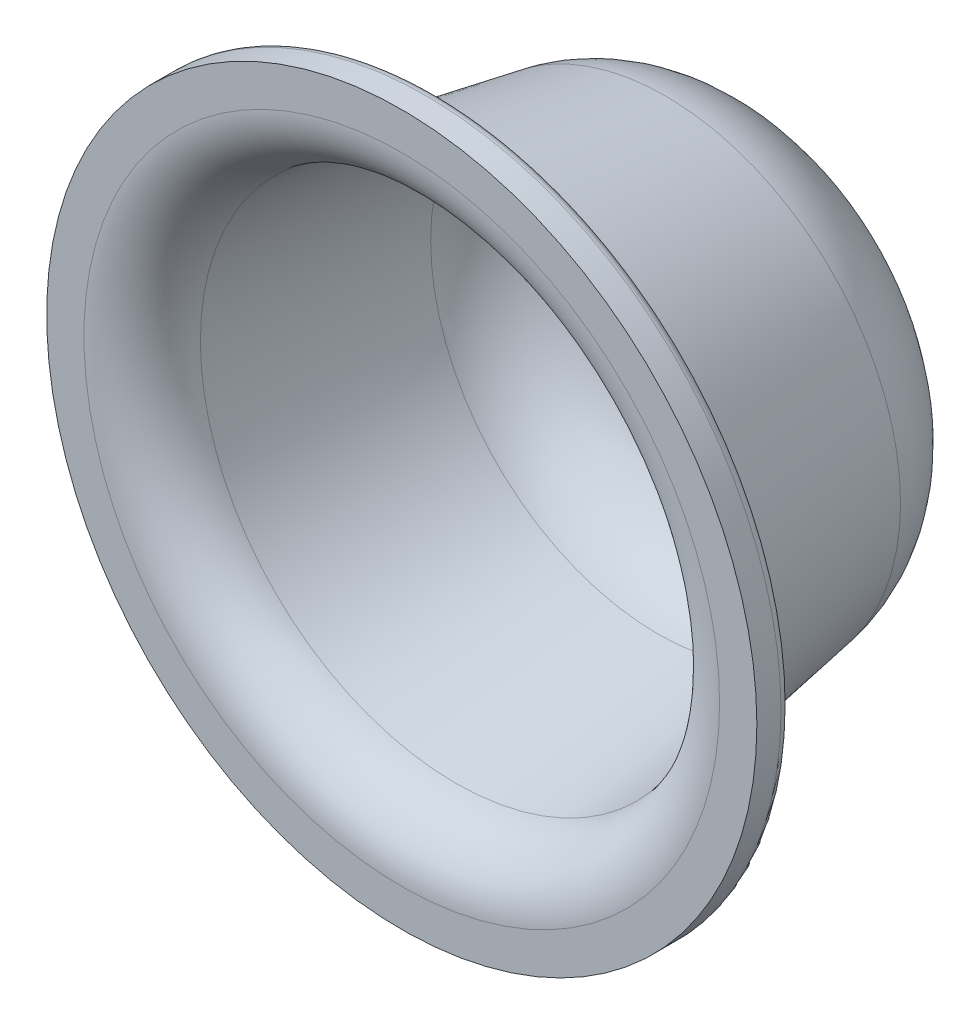
ISO-10303-21;
HEADER;
FILE_DESCRIPTION(('STEP AP214'),'2;1');
FILE_NAME('part.step','',(''),(''),'','','');
FILE_SCHEMA(('AUTOMOTIVE_DESIGN { 1 0 10303 214 1 1 1 1 }'));
ENDSEC;
DATA;
#1=APPLICATION_CONTEXT('core data for automotive mechanical design processes');
#2=APPLICATION_PROTOCOL_DEFINITION('international standard','automotive_design',2000,#1);
#3=PRODUCT_CONTEXT('',#1,'mechanical');
#4=PRODUCT('Part','Part','',(#3));
#5=PRODUCT_RELATED_PRODUCT_CATEGORY('part','',(#4));
#6=PRODUCT_DEFINITION_FORMATION('','',#4);
#7=PRODUCT_DEFINITION_CONTEXT('part definition',#1,'design');
#8=PRODUCT_DEFINITION('design','',#6,#7);
#9=PRODUCT_DEFINITION_SHAPE('','',#8);
#10=(LENGTH_UNIT() NAMED_UNIT(*) SI_UNIT(.MILLI.,.METRE.));
#11=(NAMED_UNIT(*) PLANE_ANGLE_UNIT() SI_UNIT($,.RADIAN.));
#12=(NAMED_UNIT(*) SI_UNIT($,.STERADIAN.) SOLID_ANGLE_UNIT());
#13=UNCERTAINTY_MEASURE_WITH_UNIT(LENGTH_MEASURE(1.E-05),#10,'distance_accuracy_value','');
#14=(GEOMETRIC_REPRESENTATION_CONTEXT(3) GLOBAL_UNCERTAINTY_ASSIGNED_CONTEXT((#13)) GLOBAL_UNIT_ASSIGNED_CONTEXT((#10,
#11,#12)) REPRESENTATION_CONTEXT('',''));
#15=CARTESIAN_POINT('',(0.,0.,0.));
#16=DIRECTION('',(0.,0.,1.));
#17=DIRECTION('',(1.,0.,0.));
#18=AXIS2_PLACEMENT_3D('',#15,#16,#17);
#19=CARTESIAN_POINT('',(0.,50.,0.));
#20=DIRECTION('',(0.,0.,-1.));
#21=DIRECTION('',(-1.,0.,0.));
#22=AXIS2_PLACEMENT_3D('',#19,#20,#21);
#23=PLANE('',#22);
#24=CARTESIAN_POINT('',(0.,0.,0.));
#25=DIRECTION('',(0.,0.,1.));
#26=DIRECTION('',(1.,0.,0.));
#27=AXIS2_PLACEMENT_3D('',#24,#25,#26);
#28=CIRCLE('',#27,44.75);
#29=CARTESIAN_POINT('',(44.75,0.,0.));
#30=VERTEX_POINT('',#29);
#31=EDGE_CURVE('E10',#30,#30,#28,.T.);
#32=ORIENTED_EDGE('',*,*,#31,.F.);
#33=EDGE_LOOP('',(#32));
#34=FACE_BOUND('',#33,.T.);
#35=CARTESIAN_POINT('',(0.,0.,0.));
#36=DIRECTION('',(0.,0.,1.));
#37=DIRECTION('',(1.,0.,0.));
#38=AXIS2_PLACEMENT_3D('',#35,#36,#37);
#39=CIRCLE('',#38,50.);
#40=CARTESIAN_POINT('',(50.,0.,0.));
#41=VERTEX_POINT('',#40);
#42=EDGE_CURVE('E82',#41,#41,#39,.T.);
#43=ORIENTED_EDGE('',*,*,#42,.T.);
#44=EDGE_LOOP('',(#43));
#45=FACE_BOUND('',#44,.T.);
#46=ADVANCED_FACE('F39',(#34,#45),#23,.F.);
#47=CARTESIAN_POINT('',(0.,0.,-8.85));
#48=DIRECTION('',(0.,0.,1.));
#49=DIRECTION('',(1.,0.,0.));
#50=AXIS2_PLACEMENT_3D('',#47,#48,#49);
#51=TOROIDAL_SURFACE('',#50,44.75,8.85000000000001);
#52=CARTESIAN_POINT('',(0.,0.,-7.62744997389183));
#53=DIRECTION('',(0.,0.,1.));
#54=DIRECTION('',(1.,0.,0.));
#55=AXIS2_PLACEMENT_3D('',#52,#53,#54);
#56=CIRCLE('',#55,35.9848490353181);
#57=CARTESIAN_POINT('',(35.9848490353181,0.,-7.62744997389183));
#58=VERTEX_POINT('',#57);
#59=EDGE_CURVE('E45',#58,#58,#56,.T.);
#60=ORIENTED_EDGE('',*,*,#59,.F.);
#61=EDGE_LOOP('',(#60));
#62=FACE_BOUND('',#61,.T.);
#63=ORIENTED_EDGE('',*,*,#31,.T.);
#64=EDGE_LOOP('',(#63));
#65=FACE_BOUND('',#64,.T.);
#66=ADVANCED_FACE('F146',(#62,#65),#51,.T.);
#67=CARTESIAN_POINT('',(0.,0.,-7.62744997389183));
#68=DIRECTION('',(0.,0.,1.));
#69=DIRECTION('',(1.,0.,0.));
#70=AXIS2_PLACEMENT_3D('',#67,#68,#69);
#71=CONICAL_SURFACE('',#70,35.9848490353181,0.138584420553652);
#72=CARTESIAN_POINT('',(0.,0.,-36.083977442431));
#73=DIRECTION('',(0.,0.,1.));
#74=DIRECTION('',(1.,0.,0.));
#75=AXIS2_PLACEMENT_3D('',#72,#73,#74);
#76=CIRCLE('',#75,32.0157755373498);
#77=CARTESIAN_POINT('',(32.0157755373498,0.,-36.083977442431));
#78=VERTEX_POINT('',#77);
#79=EDGE_CURVE('E49',#78,#78,#76,.T.);
#80=ORIENTED_EDGE('',*,*,#79,.F.);
#81=EDGE_LOOP('',(#80));
#82=FACE_BOUND('',#81,.T.);
#83=ORIENTED_EDGE('',*,*,#59,.T.);
#84=EDGE_LOOP('',(#83));
#85=FACE_BOUND('',#84,.T.);
#86=ADVANCED_FACE('F151',(#82,#85),#71,.F.);
#87=CARTESIAN_POINT('',(0.,0.,-34.15));
#88=DIRECTION('',(0.,0.,1.));
#89=DIRECTION('',(1.,0.,0.));
#90=AXIS2_PLACEMENT_3D('',#87,#88,#89);
#91=TOROIDAL_SURFACE('',#90,18.15,14.);
#92=CARTESIAN_POINT('',(0.,0.,-48.15));
#93=DIRECTION('',(0.,0.,1.));
#94=DIRECTION('',(1.,0.,0.));
#95=AXIS2_PLACEMENT_3D('',#92,#93,#94);
#96=CIRCLE('',#95,18.15);
#97=CARTESIAN_POINT('',(18.15,0.,-48.15));
#98=VERTEX_POINT('',#97);
#99=EDGE_CURVE('E53',#98,#98,#96,.T.);
#100=ORIENTED_EDGE('',*,*,#99,.F.);
#101=EDGE_LOOP('',(#100));
#102=FACE_BOUND('',#101,.T.);
#103=ORIENTED_EDGE('',*,*,#79,.T.);
#104=EDGE_LOOP('',(#103));
#105=FACE_BOUND('',#104,.T.);
#106=ADVANCED_FACE('F142',(#102,#105),#91,.F.);
#107=CARTESIAN_POINT('',(0.,18.15,-48.15));
#108=DIRECTION('',(0.,0.,-1.));
#109=DIRECTION('',(-1.,0.,0.));
#110=AXIS2_PLACEMENT_3D('',#107,#108,#109);
#111=PLANE('',#110);
#112=ORIENTED_EDGE('',*,*,#99,.T.);
#113=EDGE_LOOP('',(#112));
#114=FACE_BOUND('',#113,.T.);
#115=ADVANCED_FACE('F137',(#114),#111,.F.);
#116=CARTESIAN_POINT('',(0.,15.3805252124637,-52.));
#117=DIRECTION('',(0.,0.,1.));
#118=DIRECTION('',(1.,0.,0.));
#119=AXIS2_PLACEMENT_3D('',#116,#117,#118);
#120=PLANE('',#119);
#121=CARTESIAN_POINT('',(0.,0.,-52.));
#122=DIRECTION('',(0.,0.,1.));
#123=DIRECTION('',(1.,0.,0.));
#124=AXIS2_PLACEMENT_3D('',#121,#122,#123);
#125=CIRCLE('',#124,15.3805252124637);
#126=CARTESIAN_POINT('',(15.3805252124637,0.,-52.));
#127=VERTEX_POINT('',#126);
#128=EDGE_CURVE('E58',#127,#127,#125,.T.);
#129=ORIENTED_EDGE('',*,*,#128,.F.);
#130=EDGE_LOOP('',(#129));
#131=FACE_BOUND('',#130,.T.);
#132=ADVANCED_FACE('F132',(#131),#120,.F.);
#133=CARTESIAN_POINT('',(0.,0.,-34.));
#134=DIRECTION('',(0.,0.,1.));
#135=DIRECTION('',(1.,0.,0.));
#136=AXIS2_PLACEMENT_3D('',#133,#134,#135);
#137=DEGENERATE_TOROIDAL_SURFACE('',#136,15.3805252124637,18.,.T.);
#138=CARTESIAN_POINT('',(0.,0.,-37.1256671980048));
#139=DIRECTION('',(0.,0.,1.));
#140=DIRECTION('',(1.,0.,0.));
#141=AXIS2_PLACEMENT_3D('',#138,#139,#140);
#142=CIRCLE('',#141,33.1070647666834);
#143=CARTESIAN_POINT('',(33.1070647666834,0.,-37.1256671980048));
#144=VERTEX_POINT('',#143);
#145=EDGE_CURVE('E61',#144,#144,#142,.T.);
#146=ORIENTED_EDGE('',*,*,#145,.F.);
#147=EDGE_LOOP('',(#146));
#148=FACE_BOUND('',#147,.T.);
#149=ORIENTED_EDGE('',*,*,#128,.T.);
#150=EDGE_LOOP('',(#149));
#151=FACE_BOUND('',#150,.T.);
#152=ADVANCED_FACE('F126',(#148,#151),#137,.T.);
#153=CARTESIAN_POINT('',(0.,0.,-37.1256671980048));
#154=DIRECTION('',(0.,0.,1.));
#155=DIRECTION('',(1.,0.,0.));
#156=AXIS2_PLACEMENT_3D('',#153,#154,#155);
#157=CONICAL_SURFACE('',#156,33.1070647666834,0.174532925199434);
#158=CARTESIAN_POINT('',(0.,0.,-7.15811093399841));
#159=DIRECTION('',(0.,0.,1.));
#160=DIRECTION('',(1.,0.,0.));
#161=AXIS2_PLACEMENT_3D('',#158,#159,#160);
#162=CIRCLE('',#161,38.3911534819267);
#163=CARTESIAN_POINT('',(38.3911534819267,0.,-7.15811093399841));
#164=VERTEX_POINT('',#163);
#165=EDGE_CURVE('E64',#164,#164,#162,.T.);
#166=ORIENTED_EDGE('',*,*,#165,.F.);
#167=EDGE_LOOP('',(#166));
#168=FACE_BOUND('',#167,.T.);
#169=ORIENTED_EDGE('',*,*,#145,.T.);
#170=EDGE_LOOP('',(#169));
#171=FACE_BOUND('',#170,.T.);
#172=ADVANCED_FACE('F120',(#168,#171),#157,.T.);
#173=CARTESIAN_POINT('',(0.,0.,-8.2));
#174=DIRECTION('',(0.,0.,1.));
#175=DIRECTION('',(1.,0.,0.));
#176=AXIS2_PLACEMENT_3D('',#173,#174,#175);
#177=TOROIDAL_SURFACE('',#176,44.3,6.);
#178=CARTESIAN_POINT('',(0.,0.,-2.2));
#179=DIRECTION('',(0.,0.,1.));
#180=DIRECTION('',(1.,0.,0.));
#181=AXIS2_PLACEMENT_3D('',#178,#179,#180);
#182=CIRCLE('',#181,44.3);
#183=CARTESIAN_POINT('',(44.3,0.,-2.2));
#184=VERTEX_POINT('',#183);
#185=EDGE_CURVE('E67',#184,#184,#182,.T.);
#186=ORIENTED_EDGE('',*,*,#185,.F.);
#187=EDGE_LOOP('',(#186));
#188=FACE_BOUND('',#187,.T.);
#189=ORIENTED_EDGE('',*,*,#165,.T.);
#190=EDGE_LOOP('',(#189));
#191=FACE_BOUND('',#190,.T.);
#192=ADVANCED_FACE('F114',(#188,#191),#177,.F.);
#193=CARTESIAN_POINT('',(0.,46.2,-2.2));
#194=DIRECTION('',(0.,0.,1.));
#195=DIRECTION('',(1.,0.,0.));
#196=AXIS2_PLACEMENT_3D('',#193,#194,#195);
#197=PLANE('',#196);
#198=CARTESIAN_POINT('',(0.,0.,-2.2));
#199=DIRECTION('',(0.,0.,1.));
#200=DIRECTION('',(1.,0.,0.));
#201=AXIS2_PLACEMENT_3D('',#198,#199,#200);
#202=CIRCLE('',#201,46.2);
#203=CARTESIAN_POINT('',(46.2,0.,-2.2));
#204=VERTEX_POINT('',#203);
#205=EDGE_CURVE('E70',#204,#204,#202,.T.);
#206=ORIENTED_EDGE('',*,*,#205,.F.);
#207=EDGE_LOOP('',(#206));
#208=FACE_BOUND('',#207,.T.);
#209=ORIENTED_EDGE('',*,*,#185,.T.);
#210=EDGE_LOOP('',(#209));
#211=FACE_BOUND('',#210,.T.);
#212=ADVANCED_FACE('F108',(#208,#211),#197,.F.);
#213=CARTESIAN_POINT('',(0.,0.,-3.2));
#214=DIRECTION('',(0.,0.,1.));
#215=DIRECTION('',(1.,0.,0.));
#216=AXIS2_PLACEMENT_3D('',#213,#214,#215);
#217=TOROIDAL_SURFACE('',#216,46.2,1.);
#218=CARTESIAN_POINT('',(0.,0.,-3.2));
#219=DIRECTION('',(0.,0.,1.));
#220=DIRECTION('',(1.,0.,0.));
#221=AXIS2_PLACEMENT_3D('',#218,#219,#220);
#222=CIRCLE('',#221,47.2);
#223=CARTESIAN_POINT('',(47.2,0.,-3.2));
#224=VERTEX_POINT('',#223);
#225=EDGE_CURVE('E73',#224,#224,#222,.T.);
#226=ORIENTED_EDGE('',*,*,#225,.F.);
#227=EDGE_LOOP('',(#226));
#228=FACE_BOUND('',#227,.T.);
#229=ORIENTED_EDGE('',*,*,#205,.T.);
#230=EDGE_LOOP('',(#229));
#231=FACE_BOUND('',#230,.T.);
#232=ADVANCED_FACE('F102',(#228,#231),#217,.F.);
#233=CARTESIAN_POINT('',(0.,0.,0.));
#234=DIRECTION('',(0.,0.,1.));
#235=DIRECTION('',(1.,0.,0.));
#236=AXIS2_PLACEMENT_3D('',#233,#234,#235);
#237=CYLINDRICAL_SURFACE('',#236,47.2);
#238=CARTESIAN_POINT('',(0.,0.,-3.4));
#239=DIRECTION('',(0.,0.,1.));
#240=DIRECTION('',(1.,0.,0.));
#241=AXIS2_PLACEMENT_3D('',#238,#239,#240);
#242=CIRCLE('',#241,47.2);
#243=CARTESIAN_POINT('',(47.2,0.,-3.4));
#244=VERTEX_POINT('',#243);
#245=EDGE_CURVE('E76',#244,#244,#242,.T.);
#246=ORIENTED_EDGE('',*,*,#245,.F.);
#247=EDGE_LOOP('',(#246));
#248=FACE_BOUND('',#247,.T.);
#249=ORIENTED_EDGE('',*,*,#225,.T.);
#250=EDGE_LOOP('',(#249));
#251=FACE_BOUND('',#250,.T.);
#252=ADVANCED_FACE('F96',(#248,#251),#237,.F.);
#253=CARTESIAN_POINT('',(0.,0.,-3.4));
#254=DIRECTION('',(0.,0.,1.));
#255=DIRECTION('',(1.,0.,0.));
#256=AXIS2_PLACEMENT_3D('',#253,#254,#255);
#257=TOROIDAL_SURFACE('',#256,48.6,1.4);
#258=CARTESIAN_POINT('',(0.,0.,-3.4));
#259=DIRECTION('',(0.,0.,1.));
#260=DIRECTION('',(1.,0.,0.));
#261=AXIS2_PLACEMENT_3D('',#258,#259,#260);
#262=CIRCLE('',#261,50.);
#263=CARTESIAN_POINT('',(50.,0.,-3.4));
#264=VERTEX_POINT('',#263);
#265=EDGE_CURVE('E79',#264,#264,#262,.T.);
#266=ORIENTED_EDGE('',*,*,#265,.F.);
#267=EDGE_LOOP('',(#266));
#268=FACE_BOUND('',#267,.T.);
#269=ORIENTED_EDGE('',*,*,#245,.T.);
#270=EDGE_LOOP('',(#269));
#271=FACE_BOUND('',#270,.T.);
#272=ADVANCED_FACE('F90',(#268,#271),#257,.T.);
#273=CARTESIAN_POINT('',(0.,0.,0.));
#274=DIRECTION('',(0.,0.,1.));
#275=DIRECTION('',(1.,0.,0.));
#276=AXIS2_PLACEMENT_3D('',#273,#274,#275);
#277=CYLINDRICAL_SURFACE('',#276,50.);
#278=ORIENTED_EDGE('',*,*,#42,.F.);
#279=EDGE_LOOP('',(#278));
#280=FACE_BOUND('',#279,.T.);
#281=ORIENTED_EDGE('',*,*,#265,.T.);
#282=EDGE_LOOP('',(#281));
#283=FACE_BOUND('',#282,.T.);
#284=ADVANCED_FACE('F87',(#280,#283),#277,.T.);
#285=CLOSED_SHELL('',(#46,#66,#86,#106,#115,#132,#152,#172,#192,#212,#232,#252,#272,#284));
#286=MANIFOLD_SOLID_BREP('B2',#285);
#287=ADVANCED_BREP_SHAPE_REPRESENTATION('',(#18,#286),#14);
#288=SHAPE_DEFINITION_REPRESENTATION(#9,#287);
ENDSEC;
END-ISO-10303-21;
